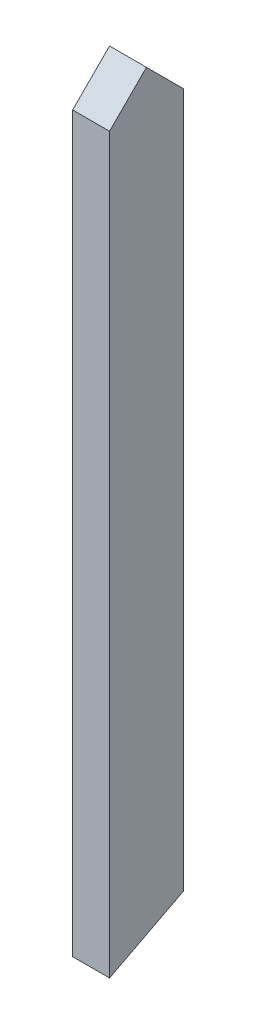
ISO-10303-21;
HEADER;
FILE_DESCRIPTION(('STEP AP214'),'2;1');
FILE_NAME('part.step','',(''),(''),'','','');
FILE_SCHEMA(('AUTOMOTIVE_DESIGN { 1 0 10303 214 1 1 1 1 }'));
ENDSEC;
DATA;
#1=APPLICATION_CONTEXT('core data for automotive mechanical design processes');
#2=APPLICATION_PROTOCOL_DEFINITION('international standard','automotive_design',2000,#1);
#3=PRODUCT_CONTEXT('',#1,'mechanical');
#4=PRODUCT('Part','Part','',(#3));
#5=PRODUCT_RELATED_PRODUCT_CATEGORY('part','',(#4));
#6=PRODUCT_DEFINITION_FORMATION('','',#4);
#7=PRODUCT_DEFINITION_CONTEXT('part definition',#1,'design');
#8=PRODUCT_DEFINITION('design','',#6,#7);
#9=PRODUCT_DEFINITION_SHAPE('','',#8);
#10=(LENGTH_UNIT() NAMED_UNIT(*) SI_UNIT(.MILLI.,.METRE.));
#11=(NAMED_UNIT(*) PLANE_ANGLE_UNIT() SI_UNIT($,.RADIAN.));
#12=(NAMED_UNIT(*) SI_UNIT($,.STERADIAN.) SOLID_ANGLE_UNIT());
#13=UNCERTAINTY_MEASURE_WITH_UNIT(LENGTH_MEASURE(1.E-05),#10,'distance_accuracy_value','');
#14=(GEOMETRIC_REPRESENTATION_CONTEXT(3) GLOBAL_UNCERTAINTY_ASSIGNED_CONTEXT((#13)) GLOBAL_UNIT_ASSIGNED_CONTEXT((#10,
#11,#12)) REPRESENTATION_CONTEXT('',''));
#15=CARTESIAN_POINT('',(0.,0.,0.));
#16=DIRECTION('',(0.,0.,1.));
#17=DIRECTION('',(1.,0.,0.));
#18=AXIS2_PLACEMENT_3D('',#15,#16,#17);
#19=CARTESIAN_POINT('',(-12.5,521.512,-25.));
#20=DIRECTION('',(1.,0.,0.));
#21=DIRECTION('',(0.,0.,-1.));
#22=AXIS2_PLACEMENT_3D('',#19,#20,#21);
#23=PLANE('',#22);
#24=DIRECTION('',(0.,0.707106781186548,-0.707106781186547));
#25=VECTOR('',#24,1.);
#26=CARTESIAN_POINT('',(-12.5,534.012,-12.5));
#27=LINE('',#26,#25);
#28=CARTESIAN_POINT('',(-12.5,496.512,25.));
#29=VERTEX_POINT('',#28);
#30=CARTESIAN_POINT('',(-12.5,521.512,0.));
#31=VERTEX_POINT('',#30);
#32=EDGE_CURVE('E123',#29,#31,#27,.T.);
#33=ORIENTED_EDGE('',*,*,#32,.T.);
#34=DIRECTION('',(0.,-0.707106781186538,-0.707106781186557));
#35=VECTOR('',#34,1.);
#36=CARTESIAN_POINT('',(-12.5,509.012,-12.5000000000003));
#37=LINE('',#36,#35);
#38=CARTESIAN_POINT('',(-12.5,496.512000000001,-25.));
#39=VERTEX_POINT('',#38);
#40=EDGE_CURVE('E65',#31,#39,#37,.T.);
#41=ORIENTED_EDGE('',*,*,#40,.T.);
#42=DIRECTION('',(0.,-1.,0.));
#43=VECTOR('',#42,1.);
#44=CARTESIAN_POINT('',(-12.5,521.512,-25.));
#45=LINE('',#44,#43);
#46=CARTESIAN_POINT('',(-12.5,25.90361446,-25.));
#47=VERTEX_POINT('',#46);
#48=EDGE_CURVE('E130',#39,#47,#45,.T.);
#49=ORIENTED_EDGE('',*,*,#48,.T.);
#50=DIRECTION('',(0.,-0.460004876257167,0.887916388980195));
#51=VECTOR('',#50,1.);
#52=CARTESIAN_POINT('',(-12.5,130.776572228875,-227.429197536928));
#53=LINE('',#52,#51);
#54=CARTESIAN_POINT('',(-12.5,0.,25.));
#55=VERTEX_POINT('',#54);
#56=EDGE_CURVE('E111',#47,#55,#53,.T.);
#57=ORIENTED_EDGE('',*,*,#56,.T.);
#58=DIRECTION('',(0.,-1.,0.));
#59=VECTOR('',#58,1.);
#60=CARTESIAN_POINT('',(-12.5,521.512,25.));
#61=LINE('',#60,#59);
#62=EDGE_CURVE('E51',#29,#55,#61,.T.);
#63=ORIENTED_EDGE('',*,*,#62,.F.);
#64=EDGE_LOOP('',(#33,#41,#49,#57,#63));
#65=FACE_BOUND('',#64,.T.);
#66=ADVANCED_FACE('F43',(#65),#23,.F.);
#67=CARTESIAN_POINT('',(12.5,521.512,25.));
#68=DIRECTION('',(0.,0.,-1.));
#69=DIRECTION('',(-1.,0.,0.));
#70=AXIS2_PLACEMENT_3D('',#67,#68,#69);
#71=PLANE('',#70);
#72=DIRECTION('',(0.,-1.,0.));
#73=VECTOR('',#72,1.);
#74=CARTESIAN_POINT('',(12.5,521.512,25.));
#75=LINE('',#74,#73);
#76=CARTESIAN_POINT('',(12.5,496.512,25.));
#77=VERTEX_POINT('',#76);
#78=CARTESIAN_POINT('',(12.5,0.,25.));
#79=VERTEX_POINT('',#78);
#80=EDGE_CURVE('E135',#77,#79,#75,.T.);
#81=ORIENTED_EDGE('',*,*,#80,.F.);
#82=DIRECTION('',(1.,0.,0.));
#83=VECTOR('',#82,1.);
#84=CARTESIAN_POINT('',(-509.01,496.512,25.));
#85=LINE('',#84,#83);
#86=EDGE_CURVE('E106',#29,#77,#85,.T.);
#87=ORIENTED_EDGE('',*,*,#86,.F.);
#88=ORIENTED_EDGE('',*,*,#62,.T.);
#89=DIRECTION('',(1.,0.,0.));
#90=VECTOR('',#89,1.);
#91=CARTESIAN_POINT('',(12.5,0.,25.));
#92=LINE('',#91,#90);
#93=EDGE_CURVE('E126',#55,#79,#92,.T.);
#94=ORIENTED_EDGE('',*,*,#93,.T.);
#95=EDGE_LOOP('',(#81,#87,#88,#94));
#96=FACE_BOUND('',#95,.T.);
#97=ADVANCED_FACE('F141',(#96),#71,.F.);
#98=CARTESIAN_POINT('',(12.5,521.512,-25.));
#99=DIRECTION('',(-1.,0.,0.));
#100=DIRECTION('',(0.,0.,1.));
#101=AXIS2_PLACEMENT_3D('',#98,#99,#100);
#102=PLANE('',#101);
#103=DIRECTION('',(0.,-1.,0.));
#104=VECTOR('',#103,1.);
#105=CARTESIAN_POINT('',(12.5,521.512,-25.));
#106=LINE('',#105,#104);
#107=CARTESIAN_POINT('',(12.5,496.512000000001,-25.));
#108=VERTEX_POINT('',#107);
#109=CARTESIAN_POINT('',(12.5,25.90361446,-25.));
#110=VERTEX_POINT('',#109);
#111=EDGE_CURVE('E100',#108,#110,#106,.T.);
#112=ORIENTED_EDGE('',*,*,#111,.F.);
#113=DIRECTION('',(0.,-0.707106781186538,-0.707106781186557));
#114=VECTOR('',#113,1.);
#115=CARTESIAN_POINT('',(12.5,521.512,0.));
#116=LINE('',#115,#114);
#117=CARTESIAN_POINT('',(12.5,521.512,0.));
#118=VERTEX_POINT('',#117);
#119=EDGE_CURVE('E89',#118,#108,#116,.T.);
#120=ORIENTED_EDGE('',*,*,#119,.F.);
#121=DIRECTION('',(0.,0.707106781186548,-0.707106781186547));
#122=VECTOR('',#121,1.);
#123=CARTESIAN_POINT('',(12.5,496.512,25.));
#124=LINE('',#123,#122);
#125=EDGE_CURVE('E98',#77,#118,#124,.T.);
#126=ORIENTED_EDGE('',*,*,#125,.F.);
#127=ORIENTED_EDGE('',*,*,#80,.T.);
#128=DIRECTION('',(0.,-0.460004876257167,0.887916388980195));
#129=VECTOR('',#128,1.);
#130=CARTESIAN_POINT('',(12.5,25.90361446,-25.));
#131=LINE('',#130,#129);
#132=EDGE_CURVE('E58',#110,#79,#131,.T.);
#133=ORIENTED_EDGE('',*,*,#132,.F.);
#134=EDGE_LOOP('',(#112,#120,#126,#127,#133));
#135=FACE_BOUND('',#134,.T.);
#136=ADVANCED_FACE('F97',(#135),#102,.F.);
#137=CARTESIAN_POINT('',(12.5,521.512,-25.));
#138=DIRECTION('',(0.,0.,1.));
#139=DIRECTION('',(1.,0.,0.));
#140=AXIS2_PLACEMENT_3D('',#137,#138,#139);
#141=PLANE('',#140);
#142=ORIENTED_EDGE('',*,*,#48,.F.);
#143=DIRECTION('',(1.,0.,0.));
#144=VECTOR('',#143,1.);
#145=CARTESIAN_POINT('',(-509.01,496.512000000001,-25.));
#146=LINE('',#145,#144);
#147=EDGE_CURVE('E102',#39,#108,#146,.T.);
#148=ORIENTED_EDGE('',*,*,#147,.T.);
#149=ORIENTED_EDGE('',*,*,#111,.T.);
#150=DIRECTION('',(1.,0.,0.));
#151=VECTOR('',#150,1.);
#152=CARTESIAN_POINT('',(-509.01,25.90361446,-25.));
#153=LINE('',#152,#151);
#154=EDGE_CURVE('E113',#47,#110,#153,.T.);
#155=ORIENTED_EDGE('',*,*,#154,.F.);
#156=EDGE_LOOP('',(#142,#148,#149,#155));
#157=FACE_BOUND('',#156,.T.);
#158=ADVANCED_FACE('F148',(#157),#141,.F.);
#159=CARTESIAN_POINT('',(-509.01,25.90361446,-25.));
#160=DIRECTION('',(0.,0.887916388980195,0.460004876257167));
#161=DIRECTION('',(0.,-0.460004876257167,0.887916388980195));
#162=AXIS2_PLACEMENT_3D('',#159,#160,#161);
#163=PLANE('',#162);
#164=ORIENTED_EDGE('',*,*,#154,.T.);
#165=ORIENTED_EDGE('',*,*,#132,.T.);
#166=ORIENTED_EDGE('',*,*,#93,.F.);
#167=ORIENTED_EDGE('',*,*,#56,.F.);
#168=EDGE_LOOP('',(#164,#165,#166,#167));
#169=FACE_BOUND('',#168,.T.);
#170=ADVANCED_FACE('F146',(#169),#163,.F.);
#171=CARTESIAN_POINT('',(-509.01,496.512,25.));
#172=DIRECTION('',(0.,-0.707106781186547,-0.707106781186548));
#173=DIRECTION('',(0.,0.707106781186548,-0.707106781186547));
#174=AXIS2_PLACEMENT_3D('',#171,#172,#173);
#175=PLANE('',#174);
#176=ORIENTED_EDGE('',*,*,#86,.T.);
#177=ORIENTED_EDGE('',*,*,#125,.T.);
#178=DIRECTION('',(1.,0.,0.));
#179=VECTOR('',#178,1.);
#180=CARTESIAN_POINT('',(0.,521.512,0.));
#181=LINE('',#180,#179);
#182=EDGE_CURVE('E11',#31,#118,#181,.T.);
#183=ORIENTED_EDGE('',*,*,#182,.F.);
#184=ORIENTED_EDGE('',*,*,#32,.F.);
#185=EDGE_LOOP('',(#176,#177,#183,#184));
#186=FACE_BOUND('',#185,.T.);
#187=ADVANCED_FACE('F104',(#186),#175,.F.);
#188=CARTESIAN_POINT('',(-509.01,521.512,0.));
#189=DIRECTION('',(0.,-0.707106781186557,0.707106781186538));
#190=DIRECTION('',(0.,-0.707106781186538,-0.707106781186557));
#191=AXIS2_PLACEMENT_3D('',#188,#189,#190);
#192=PLANE('',#191);
#193=ORIENTED_EDGE('',*,*,#182,.T.);
#194=ORIENTED_EDGE('',*,*,#119,.T.);
#195=ORIENTED_EDGE('',*,*,#147,.F.);
#196=ORIENTED_EDGE('',*,*,#40,.F.);
#197=EDGE_LOOP('',(#193,#194,#195,#196));
#198=FACE_BOUND('',#197,.T.);
#199=ADVANCED_FACE('F88',(#198),#192,.F.);
#200=CLOSED_SHELL('',(#66,#97,#136,#158,#170,#187,#199));
#201=MANIFOLD_SOLID_BREP('B2',#200);
#202=ADVANCED_BREP_SHAPE_REPRESENTATION('',(#18,#201),#14);
#203=SHAPE_DEFINITION_REPRESENTATION(#9,#202);
ENDSEC;
END-ISO-10303-21;
